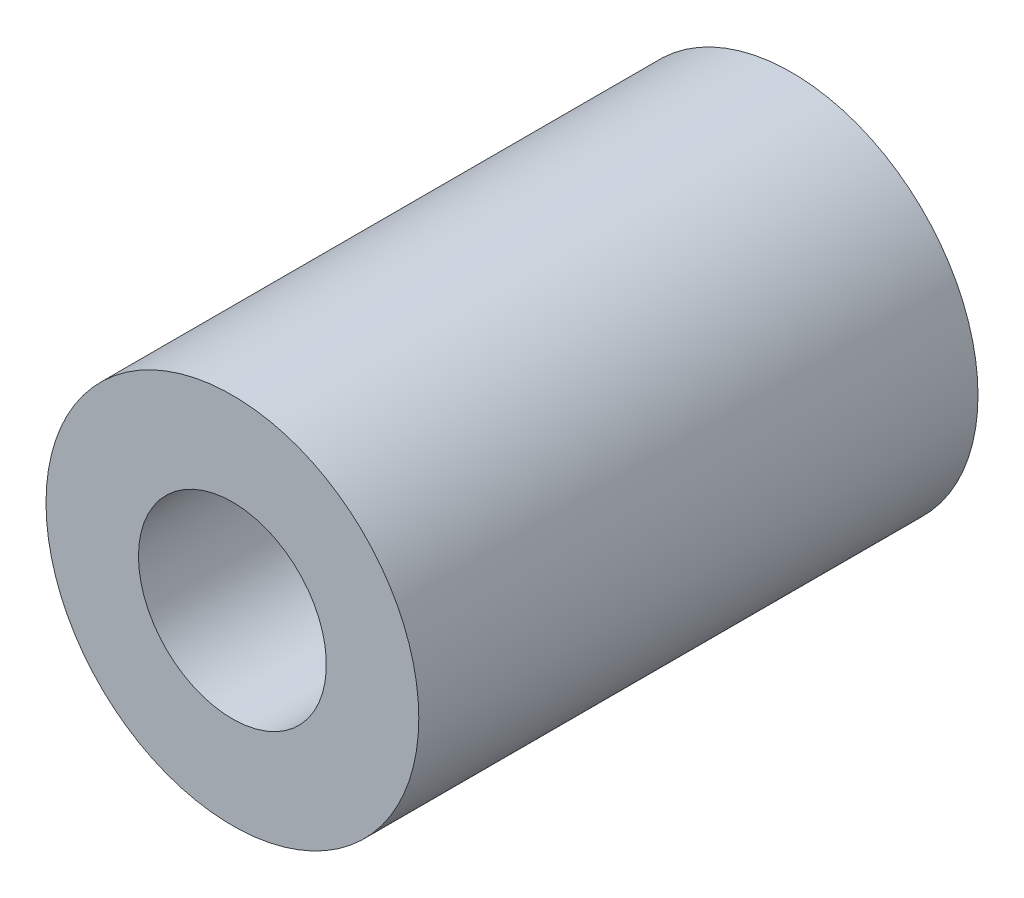
ISO-10303-21;
HEADER;
FILE_DESCRIPTION(('STEP AP214'),'2;1');
FILE_NAME('part.step','',(''),(''),'','','');
FILE_SCHEMA(('AUTOMOTIVE_DESIGN { 1 0 10303 214 1 1 1 1 }'));
ENDSEC;
DATA;
#1=APPLICATION_CONTEXT('core data for automotive mechanical design processes');
#2=APPLICATION_PROTOCOL_DEFINITION('international standard','automotive_design',2000,#1);
#3=PRODUCT_CONTEXT('',#1,'mechanical');
#4=PRODUCT('Part','Part','',(#3));
#5=PRODUCT_RELATED_PRODUCT_CATEGORY('part','',(#4));
#6=PRODUCT_DEFINITION_FORMATION('','',#4);
#7=PRODUCT_DEFINITION_CONTEXT('part definition',#1,'design');
#8=PRODUCT_DEFINITION('design','',#6,#7);
#9=PRODUCT_DEFINITION_SHAPE('','',#8);
#10=(LENGTH_UNIT() NAMED_UNIT(*) SI_UNIT(.MILLI.,.METRE.));
#11=(NAMED_UNIT(*) PLANE_ANGLE_UNIT() SI_UNIT($,.RADIAN.));
#12=(NAMED_UNIT(*) SI_UNIT($,.STERADIAN.) SOLID_ANGLE_UNIT());
#13=UNCERTAINTY_MEASURE_WITH_UNIT(LENGTH_MEASURE(1.E-05),#10,'distance_accuracy_value','');
#14=(GEOMETRIC_REPRESENTATION_CONTEXT(3) GLOBAL_UNCERTAINTY_ASSIGNED_CONTEXT((#13)) GLOBAL_UNIT_ASSIGNED_CONTEXT((#10,
#11,#12)) REPRESENTATION_CONTEXT('',''));
#15=CARTESIAN_POINT('',(0.,0.,0.));
#16=DIRECTION('',(0.,0.,1.));
#17=DIRECTION('',(1.,0.,0.));
#18=AXIS2_PLACEMENT_3D('',#15,#16,#17);
#19=CARTESIAN_POINT('',(0.,0.,9.525));
#20=DIRECTION('',(0.,0.,1.));
#21=DIRECTION('',(1.,0.,0.));
#22=AXIS2_PLACEMENT_3D('',#19,#20,#21);
#23=PLANE('',#22);
#24=CARTESIAN_POINT('',(0.,0.,9.525));
#25=DIRECTION('',(0.,0.,1.));
#26=DIRECTION('',(1.,0.,0.));
#27=AXIS2_PLACEMENT_3D('',#24,#25,#26);
#28=CIRCLE('',#27,6.35);
#29=CARTESIAN_POINT('',(-6.35,0.,9.525));
#30=VERTEX_POINT('',#29);
#31=EDGE_CURVE('E10',#30,#30,#28,.T.);
#32=ORIENTED_EDGE('',*,*,#31,.T.);
#33=EDGE_LOOP('',(#32));
#34=FACE_BOUND('',#33,.T.);
#35=CARTESIAN_POINT('',(0.,0.,9.525));
#36=DIRECTION('',(0.,0.,1.));
#37=DIRECTION('',(1.,0.,0.));
#38=AXIS2_PLACEMENT_3D('',#35,#36,#37);
#39=CIRCLE('',#38,3.2004);
#40=CARTESIAN_POINT('',(-3.2004,0.,9.525));
#41=VERTEX_POINT('',#40);
#42=EDGE_CURVE('E41',#41,#41,#39,.T.);
#43=ORIENTED_EDGE('',*,*,#42,.F.);
#44=EDGE_LOOP('',(#43));
#45=FACE_BOUND('',#44,.T.);
#46=ADVANCED_FACE('F30',(#34,#45),#23,.T.);
#47=CARTESIAN_POINT('',(0.,0.,-9.525));
#48=DIRECTION('',(0.,0.,1.));
#49=DIRECTION('',(1.,0.,0.));
#50=AXIS2_PLACEMENT_3D('',#47,#48,#49);
#51=PLANE('',#50);
#52=CARTESIAN_POINT('',(0.,0.,-9.525));
#53=DIRECTION('',(0.,0.,1.));
#54=DIRECTION('',(1.,0.,0.));
#55=AXIS2_PLACEMENT_3D('',#52,#53,#54);
#56=CIRCLE('',#55,6.35);
#57=CARTESIAN_POINT('',(-6.35,0.,-9.525));
#58=VERTEX_POINT('',#57);
#59=EDGE_CURVE('E34',#58,#58,#56,.T.);
#60=ORIENTED_EDGE('',*,*,#59,.F.);
#61=EDGE_LOOP('',(#60));
#62=FACE_BOUND('',#61,.T.);
#63=CARTESIAN_POINT('',(0.,0.,-9.525));
#64=DIRECTION('',(0.,0.,1.));
#65=DIRECTION('',(1.,0.,0.));
#66=AXIS2_PLACEMENT_3D('',#63,#64,#65);
#67=CIRCLE('',#66,3.2004);
#68=CARTESIAN_POINT('',(-3.2004,0.,-9.525));
#69=VERTEX_POINT('',#68);
#70=EDGE_CURVE('E43',#69,#69,#67,.T.);
#71=ORIENTED_EDGE('',*,*,#70,.T.);
#72=EDGE_LOOP('',(#71));
#73=FACE_BOUND('',#72,.T.);
#74=ADVANCED_FACE('F53',(#62,#73),#51,.F.);
#75=CARTESIAN_POINT('',(0.,0.,9.525));
#76=DIRECTION('',(0.,0.,-1.));
#77=DIRECTION('',(-1.,0.,0.));
#78=AXIS2_PLACEMENT_3D('',#75,#76,#77);
#79=CYLINDRICAL_SURFACE('',#78,6.35);
#80=CARTESIAN_POINT('',(-6.35,0.,9.525));
#81=CARTESIAN_POINT('',(-6.35,0.,9.3265625));
#82=CARTESIAN_POINT('',(-6.35,0.,9.128125));
#83=CARTESIAN_POINT('',(-6.35,0.,8.73125));
#84=CARTESIAN_POINT('',(-6.35,0.,8.5328125));
#85=CARTESIAN_POINT('',(-6.35,0.,8.1359375));
#86=CARTESIAN_POINT('',(-6.35,0.,7.9375));
#87=CARTESIAN_POINT('',(-6.35,0.,7.540625));
#88=CARTESIAN_POINT('',(-6.35,0.,7.3421875));
#89=CARTESIAN_POINT('',(-6.35,0.,6.9453125));
#90=CARTESIAN_POINT('',(-6.35,0.,6.746875));
#91=CARTESIAN_POINT('',(-6.35,0.,6.35));
#92=CARTESIAN_POINT('',(-6.35,0.,6.1515625));
#93=CARTESIAN_POINT('',(-6.35,0.,5.7546875));
#94=CARTESIAN_POINT('',(-6.35,0.,5.55625));
#95=CARTESIAN_POINT('',(-6.35,0.,5.159375));
#96=CARTESIAN_POINT('',(-6.35,0.,4.9609375));
#97=CARTESIAN_POINT('',(-6.35,0.,4.5640625));
#98=CARTESIAN_POINT('',(-6.35,0.,4.365625));
#99=CARTESIAN_POINT('',(-6.35,0.,3.96875));
#100=CARTESIAN_POINT('',(-6.35,0.,3.7703125));
#101=CARTESIAN_POINT('',(-6.35,0.,3.3734375));
#102=CARTESIAN_POINT('',(-6.35,0.,3.175));
#103=CARTESIAN_POINT('',(-6.35,0.,2.778125));
#104=CARTESIAN_POINT('',(-6.35,0.,2.5796875));
#105=CARTESIAN_POINT('',(-6.35,0.,2.1828125));
#106=CARTESIAN_POINT('',(-6.35,0.,1.984375));
#107=CARTESIAN_POINT('',(-6.35,0.,1.5875));
#108=CARTESIAN_POINT('',(-6.35,0.,1.3890625));
#109=CARTESIAN_POINT('',(-6.35,0.,0.992187500000001));
#110=CARTESIAN_POINT('',(-6.35,0.,0.793750000000001));
#111=CARTESIAN_POINT('',(-6.35,0.,0.396875));
#112=CARTESIAN_POINT('',(-6.35,0.,0.1984375));
#113=CARTESIAN_POINT('',(-6.35,0.,-0.1984375));
#114=CARTESIAN_POINT('',(-6.35,0.,-0.396875));
#115=CARTESIAN_POINT('',(-6.35,0.,-0.793750000000001));
#116=CARTESIAN_POINT('',(-6.35,0.,-0.992187500000001));
#117=CARTESIAN_POINT('',(-6.35,0.,-1.3890625));
#118=CARTESIAN_POINT('',(-6.35,0.,-1.5875));
#119=CARTESIAN_POINT('',(-6.35,0.,-1.984375));
#120=CARTESIAN_POINT('',(-6.35,0.,-2.1828125));
#121=CARTESIAN_POINT('',(-6.35,0.,-2.5796875));
#122=CARTESIAN_POINT('',(-6.35,0.,-2.778125));
#123=CARTESIAN_POINT('',(-6.35,0.,-3.175));
#124=CARTESIAN_POINT('',(-6.35,0.,-3.3734375));
#125=CARTESIAN_POINT('',(-6.35,0.,-3.7703125));
#126=CARTESIAN_POINT('',(-6.35,0.,-3.96875));
#127=CARTESIAN_POINT('',(-6.35,0.,-4.365625));
#128=CARTESIAN_POINT('',(-6.35,0.,-4.5640625));
#129=CARTESIAN_POINT('',(-6.35,0.,-4.9609375));
#130=CARTESIAN_POINT('',(-6.35,0.,-5.159375));
#131=CARTESIAN_POINT('',(-6.35,0.,-5.55625));
#132=CARTESIAN_POINT('',(-6.35,0.,-5.7546875));
#133=CARTESIAN_POINT('',(-6.35,0.,-6.1515625));
#134=CARTESIAN_POINT('',(-6.35,0.,-6.35));
#135=CARTESIAN_POINT('',(-6.35,0.,-6.746875));
#136=CARTESIAN_POINT('',(-6.35,0.,-6.9453125));
#137=CARTESIAN_POINT('',(-6.35,0.,-7.3421875));
#138=CARTESIAN_POINT('',(-6.35,0.,-7.540625));
#139=CARTESIAN_POINT('',(-6.35,0.,-7.9375));
#140=CARTESIAN_POINT('',(-6.35,0.,-8.1359375));
#141=CARTESIAN_POINT('',(-6.35,0.,-8.5328125));
#142=CARTESIAN_POINT('',(-6.35,0.,-8.73125));
#143=CARTESIAN_POINT('',(-6.35,0.,-9.128125));
#144=CARTESIAN_POINT('',(-6.35,0.,-9.3265625));
#145=CARTESIAN_POINT('',(-6.35,0.,-9.525));
#146=B_SPLINE_CURVE_WITH_KNOTS('',3,(#80,#81,#82,#83,#84,#85,#86,#87,#88,#89,#90,#91,#92,#93,
#94,#95,#96,#97,#98,#99,#100,#101,#102,#103,#104,#105,#106,#107,#108,#109,#110,#111,#112,#113,
#114,#115,#116,#117,#118,#119,#120,#121,#122,#123,#124,#125,#126,#127,#128,#129,#130,#131,#132,
#133,#134,#135,#136,#137,#138,#139,#140,#141,#142,#143,#144,#145),.UNSPECIFIED.,.F.,.F.,(4,2,2,
2,2,2,2,2,2,2,2,2,2,2,2,2,2,2,2,2,2,2,2,2,2,2,2,2,2,2,2,2,4),(0.,0.5953125,1.190625,1.7859375,
2.38125,2.9765625,3.571875,4.1671875,4.7625,5.3578125,5.953125,6.5484375,7.14375,7.7390625,
8.334375,8.9296875,9.525,10.1203125,10.715625,11.3109375,11.90625,12.5015625,13.096875,
13.6921875,14.2875,14.8828125,15.478125,16.0734375,16.66875,17.2640625,17.859375,18.4546875,
19.05),.UNSPECIFIED.);
#147=EDGE_CURVE('BSEAM32',#30,#58,#146,.T.);
#148=ORIENTED_EDGE('',*,*,#31,.F.);
#149=ORIENTED_EDGE('',*,*,#59,.T.);
#150=ORIENTED_EDGE('',*,*,#147,.T.);
#151=ORIENTED_EDGE('',*,*,#147,.F.);
#152=EDGE_LOOP('',(#148,#150,#149,#151));
#153=FACE_BOUND('',#152,.T.);
#154=ADVANCED_FACE('F32',(#153),#79,.T.);
#155=CARTESIAN_POINT('',(0.,0.,9.525));
#156=DIRECTION('',(0.,0.,-1.));
#157=DIRECTION('',(-1.,0.,0.));
#158=AXIS2_PLACEMENT_3D('',#155,#156,#157);
#159=CYLINDRICAL_SURFACE('',#158,3.2004);
#160=CARTESIAN_POINT('',(-3.2004,0.,9.525));
#161=CARTESIAN_POINT('',(-3.2004,0.,9.3265625));
#162=CARTESIAN_POINT('',(-3.2004,0.,9.128125));
#163=CARTESIAN_POINT('',(-3.2004,0.,8.73125));
#164=CARTESIAN_POINT('',(-3.2004,0.,8.5328125));
#165=CARTESIAN_POINT('',(-3.2004,0.,8.1359375));
#166=CARTESIAN_POINT('',(-3.2004,0.,7.9375));
#167=CARTESIAN_POINT('',(-3.2004,0.,7.540625));
#168=CARTESIAN_POINT('',(-3.2004,0.,7.3421875));
#169=CARTESIAN_POINT('',(-3.2004,0.,6.9453125));
#170=CARTESIAN_POINT('',(-3.2004,0.,6.746875));
#171=CARTESIAN_POINT('',(-3.2004,0.,6.35));
#172=CARTESIAN_POINT('',(-3.2004,0.,6.1515625));
#173=CARTESIAN_POINT('',(-3.2004,0.,5.7546875));
#174=CARTESIAN_POINT('',(-3.2004,0.,5.55625));
#175=CARTESIAN_POINT('',(-3.2004,0.,5.159375));
#176=CARTESIAN_POINT('',(-3.2004,0.,4.9609375));
#177=CARTESIAN_POINT('',(-3.2004,0.,4.5640625));
#178=CARTESIAN_POINT('',(-3.2004,0.,4.365625));
#179=CARTESIAN_POINT('',(-3.2004,0.,3.96875));
#180=CARTESIAN_POINT('',(-3.2004,0.,3.7703125));
#181=CARTESIAN_POINT('',(-3.2004,0.,3.3734375));
#182=CARTESIAN_POINT('',(-3.2004,0.,3.175));
#183=CARTESIAN_POINT('',(-3.2004,0.,2.778125));
#184=CARTESIAN_POINT('',(-3.2004,0.,2.5796875));
#185=CARTESIAN_POINT('',(-3.2004,0.,2.1828125));
#186=CARTESIAN_POINT('',(-3.2004,0.,1.984375));
#187=CARTESIAN_POINT('',(-3.2004,0.,1.5875));
#188=CARTESIAN_POINT('',(-3.2004,0.,1.3890625));
#189=CARTESIAN_POINT('',(-3.2004,0.,0.992187500000001));
#190=CARTESIAN_POINT('',(-3.2004,0.,0.793750000000001));
#191=CARTESIAN_POINT('',(-3.2004,0.,0.396875));
#192=CARTESIAN_POINT('',(-3.2004,0.,0.1984375));
#193=CARTESIAN_POINT('',(-3.2004,0.,-0.1984375));
#194=CARTESIAN_POINT('',(-3.2004,0.,-0.396875));
#195=CARTESIAN_POINT('',(-3.2004,0.,-0.793750000000001));
#196=CARTESIAN_POINT('',(-3.2004,0.,-0.992187500000001));
#197=CARTESIAN_POINT('',(-3.2004,0.,-1.3890625));
#198=CARTESIAN_POINT('',(-3.2004,0.,-1.5875));
#199=CARTESIAN_POINT('',(-3.2004,0.,-1.984375));
#200=CARTESIAN_POINT('',(-3.2004,0.,-2.1828125));
#201=CARTESIAN_POINT('',(-3.2004,0.,-2.5796875));
#202=CARTESIAN_POINT('',(-3.2004,0.,-2.778125));
#203=CARTESIAN_POINT('',(-3.2004,0.,-3.175));
#204=CARTESIAN_POINT('',(-3.2004,0.,-3.3734375));
#205=CARTESIAN_POINT('',(-3.2004,0.,-3.7703125));
#206=CARTESIAN_POINT('',(-3.2004,0.,-3.96875));
#207=CARTESIAN_POINT('',(-3.2004,0.,-4.365625));
#208=CARTESIAN_POINT('',(-3.2004,0.,-4.5640625));
#209=CARTESIAN_POINT('',(-3.2004,0.,-4.9609375));
#210=CARTESIAN_POINT('',(-3.2004,0.,-5.159375));
#211=CARTESIAN_POINT('',(-3.2004,0.,-5.55625));
#212=CARTESIAN_POINT('',(-3.2004,0.,-5.7546875));
#213=CARTESIAN_POINT('',(-3.2004,0.,-6.1515625));
#214=CARTESIAN_POINT('',(-3.2004,0.,-6.35));
#215=CARTESIAN_POINT('',(-3.2004,0.,-6.746875));
#216=CARTESIAN_POINT('',(-3.2004,0.,-6.9453125));
#217=CARTESIAN_POINT('',(-3.2004,0.,-7.3421875));
#218=CARTESIAN_POINT('',(-3.2004,0.,-7.540625));
#219=CARTESIAN_POINT('',(-3.2004,0.,-7.9375));
#220=CARTESIAN_POINT('',(-3.2004,0.,-8.1359375));
#221=CARTESIAN_POINT('',(-3.2004,0.,-8.5328125));
#222=CARTESIAN_POINT('',(-3.2004,0.,-8.73125));
#223=CARTESIAN_POINT('',(-3.2004,0.,-9.128125));
#224=CARTESIAN_POINT('',(-3.2004,0.,-9.3265625));
#225=CARTESIAN_POINT('',(-3.2004,0.,-9.525));
#226=B_SPLINE_CURVE_WITH_KNOTS('',3,(#160,#161,#162,#163,#164,#165,#166,#167,#168,#169,#170,
#171,#172,#173,#174,#175,#176,#177,#178,#179,#180,#181,#182,#183,#184,#185,#186,#187,#188,#189,
#190,#191,#192,#193,#194,#195,#196,#197,#198,#199,#200,#201,#202,#203,#204,#205,#206,#207,#208,
#209,#210,#211,#212,#213,#214,#215,#216,#217,#218,#219,#220,#221,#222,#223,#224,#225),
.UNSPECIFIED.,.F.,.F.,(4,2,2,2,2,2,2,2,2,2,2,2,2,2,2,2,2,2,2,2,2,2,2,2,2,2,2,2,2,2,2,2,4),(0.,
0.5953125,1.190625,1.7859375,2.38125,2.9765625,3.571875,4.1671875,4.7625,5.3578125,5.953125,
6.5484375,7.14375,7.7390625,8.334375,8.9296875,9.525,10.1203125,10.715625,11.3109375,11.90625,
12.5015625,13.096875,13.6921875,14.2875,14.8828125,15.478125,16.0734375,16.66875,17.2640625,
17.859375,18.4546875,19.05),.UNSPECIFIED.);
#227=EDGE_CURVE('BSEAM49',#41,#69,#226,.T.);
#228=ORIENTED_EDGE('',*,*,#42,.T.);
#229=ORIENTED_EDGE('',*,*,#70,.F.);
#230=ORIENTED_EDGE('',*,*,#227,.T.);
#231=ORIENTED_EDGE('',*,*,#227,.F.);
#232=EDGE_LOOP('',(#228,#230,#229,#231));
#233=FACE_BOUND('',#232,.T.);
#234=ADVANCED_FACE('F49',(#233),#159,.F.);
#235=CLOSED_SHELL('',(#46,#74,#154,#234));
#236=MANIFOLD_SOLID_BREP('B2',#235);
#237=ADVANCED_BREP_SHAPE_REPRESENTATION('',(#18,#236),#14);
#238=SHAPE_DEFINITION_REPRESENTATION(#9,#237);
ENDSEC;
END-ISO-10303-21;
